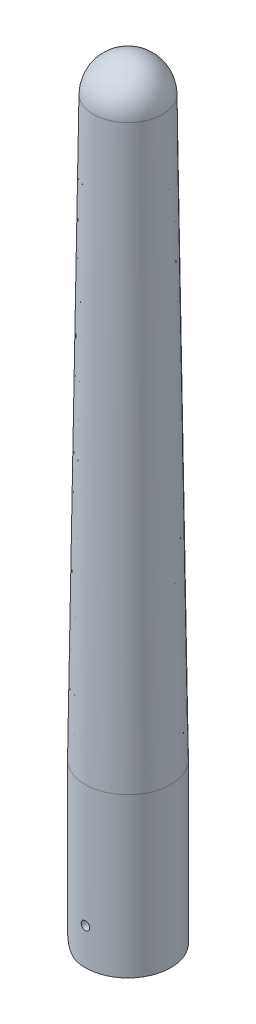
ISO-10303-21;
HEADER;
FILE_DESCRIPTION(('STEP AP214'),'2;1');
FILE_NAME('part.step','',(''),(''),'','','');
FILE_SCHEMA(('AUTOMOTIVE_DESIGN { 1 0 10303 214 1 1 1 1 }'));
ENDSEC;
DATA;
#1=APPLICATION_CONTEXT('core data for automotive mechanical design processes');
#2=APPLICATION_PROTOCOL_DEFINITION('international standard','automotive_design',2000,#1);
#3=PRODUCT_CONTEXT('',#1,'mechanical');
#4=PRODUCT('Part','Part','',(#3));
#5=PRODUCT_RELATED_PRODUCT_CATEGORY('part','',(#4));
#6=PRODUCT_DEFINITION_FORMATION('','',#4);
#7=PRODUCT_DEFINITION_CONTEXT('part definition',#1,'design');
#8=PRODUCT_DEFINITION('design','',#6,#7);
#9=PRODUCT_DEFINITION_SHAPE('','',#8);
#10=(LENGTH_UNIT() NAMED_UNIT(*) SI_UNIT(.MILLI.,.METRE.));
#11=(NAMED_UNIT(*) PLANE_ANGLE_UNIT() SI_UNIT($,.RADIAN.));
#12=(NAMED_UNIT(*) SI_UNIT($,.STERADIAN.) SOLID_ANGLE_UNIT());
#13=UNCERTAINTY_MEASURE_WITH_UNIT(LENGTH_MEASURE(1.E-05),#10,'distance_accuracy_value','');
#14=(GEOMETRIC_REPRESENTATION_CONTEXT(3) GLOBAL_UNCERTAINTY_ASSIGNED_CONTEXT((#13)) GLOBAL_UNIT_ASSIGNED_CONTEXT((#10,
#11,#12)) REPRESENTATION_CONTEXT('',''));
#15=CARTESIAN_POINT('',(0.,0.,0.));
#16=DIRECTION('',(0.,0.,1.));
#17=DIRECTION('',(1.,0.,0.));
#18=AXIS2_PLACEMENT_3D('',#15,#16,#17);
#19=CARTESIAN_POINT('',(-1.,3.5,-5.));
#20=DIRECTION('',(0.,0.,1.));
#21=DIRECTION('',(1.,0.,0.));
#22=AXIS2_PLACEMENT_3D('',#19,#20,#21);
#23=CYLINDRICAL_SURFACE('',#22,3.);
#24=DIRECTION('',(0.,0.,1.));
#25=VECTOR('',#24,1.);
#26=CARTESIAN_POINT('',(-1.,0.5,-5.));
#27=LINE('',#26,#25);
#28=CARTESIAN_POINT('',(-1.,0.5,-4.89897948556636));
#29=VERTEX_POINT('',#28);
#30=CARTESIAN_POINT('',(-1.,0.5,-3.));
#31=VERTEX_POINT('',#30);
#32=EDGE_CURVE('E148',#29,#31,#27,.T.);
#33=ORIENTED_EDGE('',*,*,#32,.T.);
#34=CARTESIAN_POINT('',(-1.,3.5,-3.));
#35=DIRECTION('',(0.,0.,-1.));
#36=DIRECTION('',(-1.,0.,0.));
#37=AXIS2_PLACEMENT_3D('',#34,#35,#36);
#38=CIRCLE('',#37,3.);
#39=CARTESIAN_POINT('',(-4.,3.5,-3.));
#40=VERTEX_POINT('',#39);
#41=EDGE_CURVE('E144',#31,#40,#38,.T.);
#42=ORIENTED_EDGE('',*,*,#41,.T.);
#43=CARTESIAN_POINT('',(-4.,3.5,-3.));
#44=CARTESIAN_POINT('',(-4.00001244204487,3.44398502961025,-2.99997000460442));
#45=CARTESIAN_POINT('',(-3.99843166086978,3.38798881357784,-3.00209095629103));
#46=CARTESIAN_POINT('',(-3.99218332919629,3.27655313093469,-3.01040203895422));
#47=CARTESIAN_POINT('',(-3.98752034536973,3.22111296364794,-3.01658614976712));
#48=CARTESIAN_POINT('',(-3.97528448696892,3.11183465613089,-3.0326897898657));
#49=CARTESIAN_POINT('',(-3.96774909464699,3.05798512684206,-3.04256117168853));
#50=CARTESIAN_POINT('',(-3.94992138177302,2.95147151927111,-3.0656705071164));
#51=CARTESIAN_POINT('',(-3.93962786416733,2.89880796649848,-3.07890992235472));
#52=CARTESIAN_POINT('',(-3.8973921371097,2.70949493381891,-3.13253561572151));
#53=CARTESIAN_POINT('',(-3.85766666829312,2.57700975431018,-3.1817867890066));
#54=CARTESIAN_POINT('',(-3.76281575029306,2.32294752534657,-3.29341572107848));
#55=CARTESIAN_POINT('',(-3.70759131741603,2.20144745358457,-3.35587719345375));
#56=CARTESIAN_POINT('',(-3.6008015299566,2.00171560896403,-3.46966247039576));
#57=CARTESIAN_POINT('',(-3.55241676573702,1.9207827573859,-3.5193163669213));
#58=CARTESIAN_POINT('',(-3.44896547463811,1.76467719994581,-3.62075693286085));
#59=CARTESIAN_POINT('',(-3.39389622830379,1.68950685887996,-3.67254446460588));
#60=CARTESIAN_POINT('',(-3.27733104616839,1.54490742978956,-3.77693381615053));
#61=CARTESIAN_POINT('',(-3.21583340729245,1.47547987197251,-3.82953584857559));
#62=CARTESIAN_POINT('',(-3.08657178818934,1.34249794552267,-3.93446368473418));
#63=CARTESIAN_POINT('',(-3.01880796290574,1.27894343174517,-3.98678949526404));
#64=CARTESIAN_POINT('',(-2.87589641380769,1.15692681649362,-4.09111014802944));
#65=CARTESIAN_POINT('',(-2.80064097491274,1.09857220388388,-4.14308349549148));
#66=CARTESIAN_POINT('',(-2.64389306071511,0.98867039552304,-4.24482739670546));
#67=CARTESIAN_POINT('',(-2.56240000879086,0.93712383032939,-4.29459774613355));
#68=CARTESIAN_POINT('',(-2.39371629381904,0.841633354519521,-4.39084474798937));
#69=CARTESIAN_POINT('',(-2.3065474130635,0.797662495452609,-4.43733271290357));
#70=CARTESIAN_POINT('',(-2.12667162452178,0.717864409452921,-4.52629205517278));
#71=CARTESIAN_POINT('',(-2.03396914878337,0.682030772788186,-4.56876657842812));
#72=CARTESIAN_POINT('',(-1.86562643412189,0.626565704791709,-4.63958414487302));
#73=CARTESIAN_POINT('',(-1.79100363230527,0.605103856305166,-4.66892248933568));
#74=CARTESIAN_POINT('',(-1.63920427713418,0.567846689857326,-4.72435562317077));
#75=CARTESIAN_POINT('',(-1.56202875641171,0.552049110464892,-4.75045170427522));
#76=CARTESIAN_POINT('',(-1.40494303198232,0.526383036102494,-4.79926444888295));
#77=CARTESIAN_POINT('',(-1.3250158631453,0.516563095829077,-4.82195233872827));
#78=CARTESIAN_POINT('',(-1.16354520558038,0.503360972757259,-4.86345234711309));
#79=CARTESIAN_POINT('',(-1.08199998593684,0.499986106567942,-4.88226003918559));
#80=CARTESIAN_POINT('',(-1.,0.5,-4.89897948556636));
#81=B_SPLINE_CURVE_WITH_KNOTS('',3,(#43,#44,#45,#46,#47,#48,#49,#50,#51,#52,#53,#54,#55,#56,#57,
#58,#59,#60,#61,#62,#63,#64,#65,#66,#67,#68,#69,#70,#71,#72,#73,#74,#75,#76,#77,#78,#79,#80),
.UNSPECIFIED.,.F.,.F.,(4,2,2,2,2,2,2,2,2,2,2,2,2,2,2,2,2,2,4),(0.,0.167952233380978,
0.335656180467112,0.501242774062107,0.666901350608378,1.10471949095996,1.54539998935887,
1.86472046160708,2.18417128151428,2.5037069491024,2.8232347176653,3.14830647568994,
3.47340832059258,3.79732869476218,4.12099302320663,4.36973894029999,4.61838543595607,
4.86902556705811,5.11995006235065),.UNSPECIFIED.);
#82=EDGE_CURVE('E163',#40,#29,#81,.T.);
#83=ORIENTED_EDGE('',*,*,#82,.T.);
#84=EDGE_LOOP('',(#33,#42,#83));
#85=FACE_BOUND('',#84,.T.);
#86=ADVANCED_FACE('F36',(#85),#23,.T.);
#87=CARTESIAN_POINT('',(0.,4.7625,-5.));
#88=DIRECTION('',(0.,0.,1.));
#89=DIRECTION('',(1.,0.,0.));
#90=AXIS2_PLACEMENT_3D('',#87,#88,#89);
#91=CYLINDRICAL_SURFACE('',#90,0.5);
#92=CARTESIAN_POINT('',(0.,4.7625,-3.));
#93=DIRECTION('',(0.,0.,-1.));
#94=DIRECTION('',(-1.,0.,0.));
#95=AXIS2_PLACEMENT_3D('',#92,#93,#94);
#96=CIRCLE('',#95,0.5);
#97=CARTESIAN_POINT('',(0.,5.2625,-3.));
#98=VERTEX_POINT('',#97);
#99=CARTESIAN_POINT('',(0.,4.2625,-3.));
#100=VERTEX_POINT('',#99);
#101=EDGE_CURVE('E51',#98,#100,#96,.F.);
#102=ORIENTED_EDGE('',*,*,#101,.T.);
#103=CARTESIAN_POINT('',(0.,4.2625,-3.));
#104=CARTESIAN_POINT('',(0.0279245639136445,4.26247519901758,-3.0000147639304));
#105=CARTESIAN_POINT('',(0.055837756491887,4.26483775850183,-2.99961054875443));
#106=CARTESIAN_POINT('',(0.110832206753166,4.2741494919612,-2.99807410355357));
#107=CARTESIAN_POINT('',(0.137914495790227,4.28109271741437,-2.9969428177627));
#108=CARTESIAN_POINT('',(0.190520410616297,4.29938067461085,-2.99406131473217));
#109=CARTESIAN_POINT('',(0.216043674938696,4.31072642264835,-2.99231095459141));
#110=CARTESIAN_POINT('',(0.26482528119673,4.33748110074219,-2.9883884234628));
#111=CARTESIAN_POINT('',(0.288083609782285,4.35289005474607,-2.98621624998891));
#112=CARTESIAN_POINT('',(0.331893550581974,4.38749005160079,-2.98166682330032));
#113=CARTESIAN_POINT('',(0.352420637095486,4.40671194518936,-2.97928799262738));
#114=CARTESIAN_POINT('',(0.389976046582247,4.4483274857591,-2.9746054532048));
#115=CARTESIAN_POINT('',(0.407003814285051,4.47072163516157,-2.97230175642609));
#116=CARTESIAN_POINT('',(0.437173866317821,4.51821486855929,-2.96801507546756));
#117=CARTESIAN_POINT('',(0.450291665381796,4.54332970856564,-2.96603414615731));
#118=CARTESIAN_POINT('',(0.472112172118847,4.59544346610524,-2.96263949656779));
#119=CARTESIAN_POINT('',(0.480815430627229,4.62244214809895,-2.96122570552704));
#120=CARTESIAN_POINT('',(0.493482800364944,4.67729572749661,-2.95914108655384));
#121=CARTESIAN_POINT('',(0.49748971053499,4.70514048162355,-2.95846355313407));
#122=CARTESIAN_POINT('',(0.500783361656072,4.76111538379644,-2.95790787498487));
#123=CARTESIAN_POINT('',(0.500070324317516,4.78924551837522,-2.95802969270745));
#124=CARTESIAN_POINT('',(0.493979010226865,4.84468566088102,-2.95905285943334));
#125=CARTESIAN_POINT('',(0.488648942843718,4.87200113598198,-2.95994615267881));
#126=CARTESIAN_POINT('',(0.473550565119978,4.92534442920873,-2.96239900004534));
#127=CARTESIAN_POINT('',(0.463782130822525,4.95137221134869,-2.96395857277451));
#128=CARTESIAN_POINT('',(0.440035229974665,5.00154623498664,-2.96757699355581));
#129=CARTESIAN_POINT('',(0.426036670162596,5.02568278834004,-2.96963821515902));
#130=CARTESIAN_POINT('',(0.394241728150704,5.07128167670101,-2.97402591987438));
#131=CARTESIAN_POINT('',(0.376445180776664,5.09274389533761,-2.97635241452118));
#132=CARTESIAN_POINT('',(0.337299196931074,5.13266247154126,-2.9810437450182));
#133=CARTESIAN_POINT('',(0.315908841019962,5.15107871053847,-2.98340870102549));
#134=CARTESIAN_POINT('',(0.270313606709418,5.18407142477227,-2.98788456267353));
#135=CARTESIAN_POINT('',(0.246107936431859,5.19864681589053,-2.98999539649458));
#136=CARTESIAN_POINT('',(0.195523810863718,5.2235495966137,-2.99372931333068));
#137=CARTESIAN_POINT('',(0.169142345470611,5.23387097856628,-2.99535170568755));
#138=CARTESIAN_POINT('',(0.115018377774362,5.24990568513903,-2.99791557548819));
#139=CARTESIAN_POINT('',(0.0872779685237822,5.25562587363564,-2.99885806696339));
#140=CARTESIAN_POINT('',(0.0395947870096444,5.26132709684266,-2.99980530629215));
#141=CARTESIAN_POINT('',(0.0197934446559688,5.26251086774561,-3.00000587638439));
#142=CARTESIAN_POINT('',(0.,5.2625,-3.));
#143=B_SPLINE_CURVE_WITH_KNOTS('',3,(#103,#104,#105,#106,#107,#108,#109,#110,#111,#112,#113,
#114,#115,#116,#117,#118,#119,#120,#121,#122,#123,#124,#125,#126,#127,#128,#129,#130,#131,#132,
#133,#134,#135,#136,#137,#138,#139,#140,#141,#142),.UNSPECIFIED.,.F.,.F.,(4,2,2,2,2,2,2,2,2,2,2,
2,2,2,2,2,2,2,2,4),(0.,0.0836539641001569,0.167199507173348,0.250764347685627,0.334329680719545,
0.41860095869616,0.502885598496281,0.587687467227778,0.672478751990037,0.756491152577013,
0.840499606871929,0.923641306490468,1.00678532827338,1.09033066685202,1.17387963955236,
1.25845388716987,1.34305198121945,1.42776914147558,1.51235968845851,1.57172612554727),.UNSPECIFIED.);
#144=EDGE_CURVE('E11',#100,#98,#143,.T.);
#145=ORIENTED_EDGE('',*,*,#144,.T.);
#146=EDGE_LOOP('',(#102,#145));
#147=FACE_BOUND('',#146,.T.);
#148=CARTESIAN_POINT('',(0.,5.2625,-5.));
#149=CARTESIAN_POINT('',(0.0280101768957787,5.26249878704981,-4.99999967760385));
#150=CARTESIAN_POINT('',(0.0560388725838866,5.26013836555178,-4.99976212798103));
#151=CARTESIAN_POINT('',(0.111319199248419,5.25075781485479,-4.99883733797369));
#152=CARTESIAN_POINT('',(0.138569939584414,5.24373255198771,-4.99814960217013));
#153=CARTESIAN_POINT('',(0.191485837726707,5.22522887970108,-4.99640207281535));
#154=CARTESIAN_POINT('',(0.217151942307455,5.21375315974076,-4.99534250400354));
#155=CARTESIAN_POINT('',(0.266188080480204,5.18667954603418,-4.99296978697153));
#156=CARTESIAN_POINT('',(0.289558569389539,5.17108247199993,-4.99165668919066));
#157=CARTESIAN_POINT('',(0.333429775337041,5.13614865116886,-4.98891872170662));
#158=CARTESIAN_POINT('',(0.353921072417447,5.11680010029898,-4.98749350786933));
#159=CARTESIAN_POINT('',(0.391371260715493,5.07493773286848,-4.98469478453131));
#160=CARTESIAN_POINT('',(0.408329988541327,5.05242376997881,-4.98332127742458));
#161=CARTESIAN_POINT('',(0.438266985221809,5.00481073415819,-4.98077795776392));
#162=CARTESIAN_POINT('',(0.45123673272744,4.97970627795257,-4.97960858355453));
#163=CARTESIAN_POINT('',(0.47277319237138,4.92766220704751,-4.97761018773262));
#164=CARTESIAN_POINT('',(0.481340013295646,4.90072263770803,-4.97678115771111));
#165=CARTESIAN_POINT('',(0.493799520800947,4.845869099567,-4.97556042036489));
#166=CARTESIAN_POINT('',(0.497707826501898,4.8179587115739,-4.97516725199048));
#167=CARTESIAN_POINT('',(0.50078764256768,4.76187556830211,-4.97485821530263));
#168=CARTESIAN_POINT('',(0.499959277435401,4.73370281993897,-4.97494233444373));
#169=CARTESIAN_POINT('',(0.493602140126339,4.67800234515334,-4.97557703449467));
#170=CARTESIAN_POINT('',(0.488090422062276,4.65047265033565,-4.97612592295326));
#171=CARTESIAN_POINT('',(0.472549572075293,4.59673101839945,-4.97762567143709));
#172=CARTESIAN_POINT('',(0.462520379127873,4.57051909908748,-4.97857653689246));
#173=CARTESIAN_POINT('',(0.438210446940754,4.52010320635056,-4.98077504726035));
#174=CARTESIAN_POINT('',(0.42392214135999,4.49590290525534,-4.98202321954079));
#175=CARTESIAN_POINT('',(0.391505013676614,4.45023739254406,-4.98467525866439));
#176=CARTESIAN_POINT('',(0.373376079168253,4.42877226100912,-4.98607913006392));
#177=CARTESIAN_POINT('',(0.333697056206035,4.38908730300549,-4.98889192656495));
#178=CARTESIAN_POINT('',(0.312132239425682,4.3708821990596,-4.99030084666499));
#179=CARTESIAN_POINT('',(0.266244740868556,4.33834818354481,-4.99295914539259));
#180=CARTESIAN_POINT('',(0.2419220559998,4.32401927632176,-4.99420852384128));
#181=CARTESIAN_POINT('',(0.191199052846182,4.29964498984487,-4.99640737833548));
#182=CARTESIAN_POINT('',(0.164798373194951,4.28960035759097,-4.99735680207385));
#183=CARTESIAN_POINT('',(0.110673608664966,4.27409054164412,-4.99884823720704));
#184=CARTESIAN_POINT('',(0.0829495633882998,4.26862522100469,-4.99939026078532));
#185=CARTESIAN_POINT('',(0.0270925495459517,4.26244784613262,-5.00000425834155));
#186=CARTESIAN_POINT('',(-0.00103815105274613,4.26171547587375,-5.00007824133868));
#187=CARTESIAN_POINT('',(-0.0570218966578501,4.26497143152438,-4.99975320878398));
#188=CARTESIAN_POINT('',(-0.0848749454102353,4.26895969365764,-4.99935419962234));
#189=CARTESIAN_POINT('',(-0.139454103417338,4.28152684771079,-4.99812930769597));
#190=CARTESIAN_POINT('',(-0.16618242448601,4.29009622723901,-4.9973043095902));
#191=CARTESIAN_POINT('',(-0.217822160691891,4.31157258701864,-4.99531999430305));
#192=CARTESIAN_POINT('',(-0.242733535078559,4.3244796645197,-4.99416066962627));
#193=CARTESIAN_POINT('',(-0.290124090086072,4.35431541933196,-4.99163237665211));
#194=CARTESIAN_POINT('',(-0.312594829874459,4.37125744446291,-4.99026271801721));
#195=CARTESIAN_POINT('',(-0.35438081165594,4.40866303387046,-4.9874696643476));
#196=CARTESIAN_POINT('',(-0.373695974424589,4.42912668653516,-4.98604626796486));
#197=CARTESIAN_POINT('',(-0.408693054943573,4.4730832873295,-4.98330012070377));
#198=CARTESIAN_POINT('',(-0.424361639339772,4.49658687827131,-4.98197775069488));
#199=CARTESIAN_POINT('',(-0.451529129371914,4.54590368007334,-4.97958916230445));
#200=CARTESIAN_POINT('',(-0.463028092026941,4.5717168593442,-4.97852294042019));
#201=CARTESIAN_POINT('',(-0.481507604342238,4.6248743697329,-4.97676973817025));
#202=CARTESIAN_POINT('',(-0.488496087405931,4.65221592004556,-4.97608209224894));
#203=CARTESIAN_POINT('',(-0.497782003564732,4.70769159898039,-4.97516182641438));
#204=CARTESIAN_POINT('',(-0.500079571199759,4.73582570484784,-4.97492919345093));
#205=CARTESIAN_POINT('',(-0.499916569235628,4.79195534417835,-4.97494556553781));
#206=CARTESIAN_POINT('',(-0.497476944796556,4.81995094144141,-4.97519245043504));
#207=CARTESIAN_POINT('',(-0.487952726481827,4.87513245858414,-4.97613551944773));
#208=CARTESIAN_POINT('',(-0.48086812738108,4.90231837755299,-4.97683170406859));
#209=CARTESIAN_POINT('',(-0.462260843148752,4.95510867452393,-4.97859434131593));
#210=CARTESIAN_POINT('',(-0.450738772170458,4.98071327081486,-4.9796607427018));
#211=CARTESIAN_POINT('',(-0.423585777455522,5.02962844583552,-4.98204375919679));
#212=CARTESIAN_POINT('',(-0.407954876727707,5.05293903741032,-4.98336037290475));
#213=CARTESIAN_POINT('',(-0.372949278142666,5.09671183723597,-4.98610243604849));
#214=CARTESIAN_POINT('',(-0.353558974445134,5.11716153818354,-4.98752832363375));
#215=CARTESIAN_POINT('',(-0.311615849612554,5.15452611634983,-4.99032427364392));
#216=CARTESIAN_POINT('',(-0.289062272054128,5.17144014567859,-4.99169432261488));
#217=CARTESIAN_POINT('',(-0.241370717080644,5.20128672692731,-4.99422781034581));
#218=CARTESIAN_POINT('',(-0.216226374673381,5.21420914547259,-4.99539072013406));
#219=CARTESIAN_POINT('',(-0.164129139550275,5.23563121141193,-4.99737314624948));
#220=CARTESIAN_POINT('',(-0.137178324912804,5.24413584547677,-4.99819304954827));
#221=CARTESIAN_POINT('',(-0.091729130702852,5.2543603085424,-4.99919106886867));
#222=CARTESIAN_POINT('',(-0.0735212764222543,5.25740852214968,-4.99949300345916));
#223=CARTESIAN_POINT('',(-0.0368782904086565,5.26147876303088,-4.99989757475393));
#224=CARTESIAN_POINT('',(-0.0184431596132789,5.26250079866093,-5.00000021228012));
#225=CARTESIAN_POINT('',(0.,5.2625,-5.));
#226=B_SPLINE_CURVE_WITH_KNOTS('',3,(#148,#149,#150,#151,#152,#153,#154,#155,#156,#157,#158,
#159,#160,#161,#162,#163,#164,#165,#166,#167,#168,#169,#170,#171,#172,#173,#174,#175,#176,#177,
#178,#179,#180,#181,#182,#183,#184,#185,#186,#187,#188,#189,#190,#191,#192,#193,#194,#195,#196,
#197,#198,#199,#200,#201,#202,#203,#204,#205,#206,#207,#208,#209,#210,#211,#212,#213,#214,#215,
#216,#217,#218,#219,#220,#221,#222,#223,#224,#225),.UNSPECIFIED.,.T.,.F.,(4,2,2,2,2,2,2,2,2,2,2,
2,2,2,2,2,2,2,2,2,2,2,2,2,2,2,2,2,2,2,2,2,2,2,2,2,2,2,4),(0.,0.083963183134237,
0.168018921417743,0.252023942866102,0.336012268791392,0.420269284311473,0.50453019610353,
0.588969877361109,0.67340747221252,0.757561160225982,0.841712636278883,0.925558987205553,
1.00940647080817,1.09340380686447,1.17740360165563,1.26177367098103,1.34614383489886,
1.43052870346791,1.5149110483772,1.59893094303879,1.68294970259572,1.76679467647153,
1.85064153024734,1.93476970374349,2.01889998905115,2.10333321804299,2.18776529237687,
2.27204845296502,2.35632919619793,2.44023814646978,2.5241471911302,2.608044626814,
2.6919415926948,2.77619458713827,2.86046776318479,2.94495315513121,3.02934297397648,
3.08462833616174,3.13991347034514),.UNSPECIFIED.);
#227=CARTESIAN_POINT('',(0.,5.2625,-5.));
#228=VERTEX_POINT('',#227);
#229=EDGE_CURVE('E199',#228,#228,#226,.T.);
#230=ORIENTED_EDGE('',*,*,#229,.T.);
#231=EDGE_LOOP('',(#230));
#232=FACE_BOUND('',#231,.T.);
#233=ADVANCED_FACE('F208',(#147,#232),#91,.F.);
#234=CARTESIAN_POINT('',(0.,0.,0.));
#235=DIRECTION('',(0.,-1.,0.));
#236=DIRECTION('',(0.,0.,-1.));
#237=AXIS2_PLACEMENT_3D('',#234,#235,#236);
#238=CYLINDRICAL_SURFACE('',#237,5.);
#239=ORIENTED_EDGE('',*,*,#229,.F.);
#240=EDGE_LOOP('',(#239));
#241=FACE_BOUND('',#240,.T.);
#242=CARTESIAN_POINT('',(0.5,4.7625,4.9749371855331));
#243=CARTESIAN_POINT('',(0.499998786696756,4.7905097820868,4.97493751398451));
#244=CARTESIAN_POINT('',(0.497638429491238,4.81853808420592,4.97517628497109));
#245=CARTESIAN_POINT('',(0.488258157381781,4.87381759314677,4.97610543779059));
#246=CARTESIAN_POINT('',(0.481233107443218,4.90106790901875,4.9767963173061));
#247=CARTESIAN_POINT('',(0.462730058034463,4.95398290960895,4.97855066523694));
#248=CARTESIAN_POINT('',(0.45125475814695,4.97964854469572,4.97961390773395));
#249=CARTESIAN_POINT('',(0.424182133695551,5.02868389614587,4.9819929028591));
#250=CARTESIAN_POINT('',(0.408585627812963,5.05205406724186,4.98330860532165));
#251=CARTESIAN_POINT('',(0.373652380999353,5.09592563182875,4.98604963354949));
#252=CARTESIAN_POINT('',(0.35430370905413,5.11641750475189,4.98747530002633));
#253=CARTESIAN_POINT('',(0.312440857659783,5.15386880450178,4.99027252617859));
#254=CARTESIAN_POINT('',(0.289926533453285,5.17082806970316,4.99164408337606));
#255=CARTESIAN_POINT('',(0.242313180825494,5.20076562850358,4.99418191577802));
#256=CARTESIAN_POINT('',(0.217208831264785,5.21373549939683,4.99534775447323));
#257=CARTESIAN_POINT('',(0.165164992143756,5.23527221657434,4.99733908437885));
#258=CARTESIAN_POINT('',(0.13822554733411,5.24383917018473,4.99816458388532));
#259=CARTESIAN_POINT('',(0.0833723913714752,5.25629895467663,4.99937983285513));
#260=CARTESIAN_POINT('',(0.0554622635157911,5.26020741637497,4.99977103921408));
#261=CARTESIAN_POINT('',(-0.00062037034447125,5.26328763456686,5.00007857799346));
#262=CARTESIAN_POINT('',(-0.0287928695272304,5.26245951387314,4.99999492272636));
#263=CARTESIAN_POINT('',(-0.0844944220322799,5.25610276367492,4.99936335655593));
#264=CARTESIAN_POINT('',(-0.112025414967489,5.25059094221805,4.99881710575856));
#265=CARTESIAN_POINT('',(-0.165769589752266,5.23504943552669,4.99732364632465));
#266=CARTESIAN_POINT('',(-0.191982754478864,5.22501969160621,4.99637643247977));
#267=CARTESIAN_POINT('',(-0.242400157339793,5.20070861837278,4.99418468741958));
#268=CARTESIAN_POINT('',(-0.266600785490825,5.18641985123492,4.99293963682879));
#269=CARTESIAN_POINT('',(-0.312266756587097,5.15400173833182,4.99029192259704));
#270=CARTESIAN_POINT('',(-0.333732019280413,5.13587227992741,4.98888925433406));
#271=CARTESIAN_POINT('',(-0.373416385911344,5.09619288524318,4.98607646733926));
#272=CARTESIAN_POINT('',(-0.391620873095172,5.07462832762921,4.98466634286514));
#273=CARTESIAN_POINT('',(-0.424153767678959,5.02874156739461,4.98200369964111));
#274=CARTESIAN_POINT('',(-0.438482169456445,5.00441936077393,4.98075118111982));
#275=CARTESIAN_POINT('',(-0.462856092286615,4.95369648740011,4.97854544757075));
#276=CARTESIAN_POINT('',(-0.47290071028648,4.92729538378856,4.97759229566277));
#277=CARTESIAN_POINT('',(-0.488410367818794,4.87316969769266,4.97609450935469));
#278=CARTESIAN_POINT('',(-0.493875546871517,4.84544515555628,4.97554986250884));
#279=CARTESIAN_POINT('',(-0.50005238769598,4.78958791023525,4.97493290263708));
#280=CARTESIAN_POINT('',(-0.500784498323606,4.76145748986758,4.97485855773802));
#281=CARTESIAN_POINT('',(-0.497528123435681,4.70547436708857,4.97518525677386));
#282=CARTESIAN_POINT('',(-0.493539701704877,4.67762166092982,4.97558629428531));
#283=CARTESIAN_POINT('',(-0.48097258725376,4.62304420886083,4.97681672211201));
#284=CARTESIAN_POINT('',(-0.472403563594454,4.59631721445267,4.97764521000673));
#285=CARTESIAN_POINT('',(-0.45092835983797,4.54467997413485,4.97963645519397));
#286=CARTESIAN_POINT('',(-0.438022080391794,4.51976976985641,4.98079922014335));
#287=CARTESIAN_POINT('',(-0.408187500711609,4.47238001298561,4.98333292177857));
#288=CARTESIAN_POINT('',(-0.391245649920346,4.44990902901687,4.98470455407336));
#289=CARTESIAN_POINT('',(-0.353840266725587,4.40812247336297,4.98749916312593));
#290=CARTESIAN_POINT('',(-0.333376647124067,4.38880697982996,4.98892214115433));
#291=CARTESIAN_POINT('',(-0.289419902113237,4.35380918330095,4.99166523924651));
#292=CARTESIAN_POINT('',(-0.265916127984727,4.33814022020689,4.99298497027737));
#293=CARTESIAN_POINT('',(-0.216598858708566,4.31097206574679,4.99536721053315));
#294=CARTESIAN_POINT('',(-0.190785395214813,4.29947281724645,4.99642972328246));
#295=CARTESIAN_POINT('',(-0.137628063216408,4.28099311617233,4.99817605207003));
#296=CARTESIAN_POINT('',(-0.11028701882498,4.27400460633739,4.99886054302824));
#297=CARTESIAN_POINT('',(-0.0548124069918398,4.26471846521008,4.99977647306824));
#298=CARTESIAN_POINT('',(-0.0266788618461089,4.26242070208298,5.00000792488281));
#299=CARTESIAN_POINT('',(0.0294511120378732,4.26258313321997,4.99999169156635));
#300=CARTESIAN_POINT('',(0.0574476036122639,4.26502261841833,4.99974609188335));
#301=CARTESIAN_POINT('',(0.112630944178181,4.27454687282849,4.99880746788795));
#302=CARTESIAN_POINT('',(0.139817792534183,4.28163164568648,4.99811444322437));
#303=CARTESIAN_POINT('',(0.192609954383872,4.30023962869647,4.99635861906981));
#304=CARTESIAN_POINT('',(0.218215483038764,4.31176223346708,4.99529587001624));
#305=CARTESIAN_POINT('',(0.267132300077398,4.33891658445849,4.99291906208148));
#306=CARTESIAN_POINT('',(0.290443601884279,4.35454830663556,4.99160500467077));
#307=CARTESIAN_POINT('',(0.334216362213469,4.38955480951188,4.98886592334527));
#308=CARTESIAN_POINT('',(0.35466546310967,4.4089450081224,4.9874404573035));
#309=CARTESIAN_POINT('',(0.392028879696571,4.45088767577272,4.98464295384829));
#310=CARTESIAN_POINT('',(0.408942345923924,4.47344090258454,4.98327092933888));
#311=CARTESIAN_POINT('',(0.438788320212027,4.52113217095996,4.980731917053));
#312=CARTESIAN_POINT('',(0.451710593997418,4.54627664066203,4.97956545962653));
#313=CARTESIAN_POINT('',(0.473132354049385,4.59837414562312,4.97757597381231));
#314=CARTESIAN_POINT('',(0.481636828944929,4.62532510196286,4.9767525582668));
#315=CARTESIAN_POINT('',(0.491860844166765,4.67077387044956,4.97575003769072));
#316=CARTESIAN_POINT('',(0.494908856199113,4.68898112565322,4.97544665967847));
#317=CARTESIAN_POINT('',(0.498978829302557,4.72562291152128,4.97504012588832));
#318=CARTESIAN_POINT('',(0.500000798878632,4.7440574412313,4.97493696926992));
#319=CARTESIAN_POINT('',(0.5,4.7625,4.9749371855331));
#320=B_SPLINE_CURVE_WITH_KNOTS('',3,(#242,#243,#244,#245,#246,#247,#248,#249,#250,#251,#252,
#253,#254,#255,#256,#257,#258,#259,#260,#261,#262,#263,#264,#265,#266,#267,#268,#269,#270,#271,
#272,#273,#274,#275,#276,#277,#278,#279,#280,#281,#282,#283,#284,#285,#286,#287,#288,#289,#290,
#291,#292,#293,#294,#295,#296,#297,#298,#299,#300,#301,#302,#303,#304,#305,#306,#307,#308,#309,
#310,#311,#312,#313,#314,#315,#316,#317,#318,#319),.UNSPECIFIED.,.T.,.F.,(4,2,2,2,2,2,2,2,2,2,2,
2,2,2,2,2,2,2,2,2,2,2,2,2,2,2,2,2,2,2,2,2,2,2,2,2,2,2,4),(0.,0.0839619972182308,
0.168016575910885,0.252020245498737,0.336007240210657,0.420265807649625,0.504528229276264,
0.588967349856458,0.673404412038973,0.757557354492248,0.841708114991162,0.925558159093308,
1.00940929240487,1.09340772733207,1.17740862609264,1.26177712542501,1.34614574713781,
1.43053214558967,1.51491597297516,1.59893498153883,1.68295285483435,1.76679407352264,
1.85063721280524,1.93476594905859,2.01889676861601,2.10333068409059,2.18776344259002,
2.27204496347181,2.35632411556575,2.44023566734241,2.52414728498329,2.60804745997623,
2.69194714405399,2.77619857518994,2.86047022517262,2.94495620535238,3.02934657447001,
3.08463013803023,3.13991346951908),.UNSPECIFIED.);
#321=CARTESIAN_POINT('',(0.5,4.7625,4.9749371855331));
#322=VERTEX_POINT('',#321);
#323=EDGE_CURVE('E193',#322,#322,#320,.T.);
#324=ORIENTED_EDGE('',*,*,#323,.F.);
#325=EDGE_LOOP('',(#324));
#326=FACE_BOUND('',#325,.T.);
#327=CARTESIAN_POINT('',(-1.,0.5,4.89897948556636));
#328=CARTESIAN_POINT('',(-1.08234962306499,0.499986264817573,4.88218859818453));
#329=CARTESIAN_POINT('',(-1.16423920706714,0.503389811860819,4.86329222431812));
#330=CARTESIAN_POINT('',(-1.32639580964566,0.516704057342398,4.82157934502137));
#331=CARTESIAN_POINT('',(-1.40666432342228,0.526608447931834,4.79876665546974));
#332=CARTESIAN_POINT('',(-1.56445735384612,0.552502856712107,4.74965919245298));
#333=CARTESIAN_POINT('',(-1.64199768099718,0.5684476963502,4.72339119209978));
#334=CARTESIAN_POINT('',(-1.7944724214973,0.606043429097126,4.66759774616889));
#335=CARTESIAN_POINT('',(-1.86940626492176,0.627695561374434,4.638071593991));
#336=CARTESIAN_POINT('',(-2.08911654476719,0.700440223503693,4.54540680144));
#337=CARTESIAN_POINT('',(-2.22953837921688,0.759447890943269,4.47794813791139));
#338=CARTESIAN_POINT('',(-2.49674966144726,0.895708440232785,4.33466791879024));
#339=CARTESIAN_POINT('',(-2.62351028590355,0.972998840115289,4.25882933959151));
#340=CARTESIAN_POINT('',(-2.87947158436822,1.15570129206003,4.09087727925126));
#341=CARTESIAN_POINT('',(-3.00641785794272,1.26355621085363,3.99798910981836));
#342=CARTESIAN_POINT('',(-3.24046585679878,1.49805037146107,3.81075239171346));
#343=CARTESIAN_POINT('',(-3.34755504339516,1.62470139175858,3.71640296079428));
#344=CARTESIAN_POINT('',(-3.52962460970653,1.88051843725028,3.54339317808233));
#345=CARTESIAN_POINT('',(-3.60688915783605,2.00768613599886,3.46418292004352));
#346=CARTESIAN_POINT('',(-3.74348939718221,2.27690421521044,3.3160777901339));
#347=CARTESIAN_POINT('',(-3.80285759734266,2.41892697112182,3.24716433030008));
#348=CARTESIAN_POINT('',(-3.88525915904755,2.67116622135991,3.14763003936433));
#349=CARTESIAN_POINT('',(-3.91384970526196,2.77746965591426,3.11177117966934));
#350=CARTESIAN_POINT('',(-3.95943785178449,2.99595219490619,3.05356277955589));
#351=CARTESIAN_POINT('',(-3.97647707300007,3.10810861938826,3.03116477144108));
#352=CARTESIAN_POINT('',(-3.99135779043266,3.26777549032209,3.01149544061086));
#353=CARTESIAN_POINT('',(-3.99458907019243,3.31400912356982,3.00720397642665));
#354=CARTESIAN_POINT('',(-3.99891271293557,3.40682000345541,3.00145055094132));
#355=CARTESIAN_POINT('',(-4.00000188306987,3.45339765930835,2.99999281339309));
#356=CARTESIAN_POINT('',(-4.,3.5,3.));
#357=B_SPLINE_CURVE_WITH_KNOTS('',3,(#327,#328,#329,#330,#331,#332,#333,#334,#335,#336,#337,
#338,#339,#340,#341,#342,#343,#344,#345,#346,#347,#348,#349,#350,#351,#352,#353,#354,#355,#356),
.UNSPECIFIED.,.F.,.F.,(4,2,2,2,2,2,2,2,2,2,2,2,2,2,4),(0.,0.251990676148488,0.503737203375385,
0.75363686292484,1.00359082549306,1.50117768777981,1.99979464555732,2.56987877280039,
3.14032166076337,3.64455080724534,4.14785841774119,4.4940317872084,4.83895112416978,
4.97846822477555,5.11819312075111),.UNSPECIFIED.);
#358=CARTESIAN_POINT('',(-1.,0.5,4.89897948556636));
#359=VERTEX_POINT('',#358);
#360=CARTESIAN_POINT('',(-4.,3.5,3.));
#361=VERTEX_POINT('',#360);
#362=EDGE_CURVE('E185',#359,#361,#357,.T.);
#363=ORIENTED_EDGE('',*,*,#362,.F.);
#364=CARTESIAN_POINT('',(0.,0.5,0.));
#365=DIRECTION('',(0.,1.,0.));
#366=DIRECTION('',(0.,0.,1.));
#367=AXIS2_PLACEMENT_3D('',#364,#365,#366);
#368=CIRCLE('',#367,5.);
#369=EDGE_CURVE('E160',#29,#359,#368,.F.);
#370=ORIENTED_EDGE('',*,*,#369,.F.);
#371=ORIENTED_EDGE('',*,*,#82,.F.);
#372=DIRECTION('',(0.,-1.,0.));
#373=VECTOR('',#372,1.);
#374=CARTESIAN_POINT('',(-4.,0.,-3.));
#375=LINE('',#374,#373);
#376=CARTESIAN_POINT('',(-4.,7.,-3.));
#377=VERTEX_POINT('',#376);
#378=EDGE_CURVE('E171',#377,#40,#375,.T.);
#379=ORIENTED_EDGE('',*,*,#378,.F.);
#380=CARTESIAN_POINT('',(0.,3.00000000000002,0.));
#381=DIRECTION('',(0.707106781186546,0.707106781186549,0.));
#382=DIRECTION('',(0.707106781186549,-0.707106781186546,0.));
#383=AXIS2_PLACEMENT_3D('',#380,#381,#382);
#384=ELLIPSE('',#383,7.07106781186546,5.);
#385=CARTESIAN_POINT('',(-4.,7.,3.));
#386=VERTEX_POINT('',#385);
#387=EDGE_CURVE('E235',#386,#377,#384,.F.);
#388=ORIENTED_EDGE('',*,*,#387,.F.);
#389=DIRECTION('',(0.,-1.,0.));
#390=VECTOR('',#389,1.);
#391=CARTESIAN_POINT('',(-4.,0.,3.));
#392=LINE('',#391,#390);
#393=EDGE_CURVE('E121',#361,#386,#392,.F.);
#394=ORIENTED_EDGE('',*,*,#393,.F.);
#395=EDGE_LOOP('',(#363,#370,#371,#379,#388,#394));
#396=FACE_BOUND('',#395,.T.);
#397=CARTESIAN_POINT('',(0.,19.05,0.));
#398=DIRECTION('',(0.,-1.,0.));
#399=DIRECTION('',(0.,0.,-1.));
#400=AXIS2_PLACEMENT_3D('',#397,#398,#399);
#401=CIRCLE('',#400,5.);
#402=CARTESIAN_POINT('',(0.,19.05,-5.));
#403=VERTEX_POINT('',#402);
#404=EDGE_CURVE('E157',#403,#403,#401,.T.);
#405=ORIENTED_EDGE('',*,*,#404,.T.);
#406=EDGE_LOOP('',(#405));
#407=FACE_BOUND('',#406,.T.);
#408=ADVANCED_FACE('F38',(#241,#326,#396,#407),#238,.T.);
#409=CARTESIAN_POINT('',(0.,19.05,0.));
#410=DIRECTION('',(0.,-1.,0.));
#411=DIRECTION('',(0.,0.,-1.));
#412=AXIS2_PLACEMENT_3D('',#409,#410,#411);
#413=CONICAL_SURFACE('',#412,5.,0.0140042925842664);
#414=CARTESIAN_POINT('',(0.,86.424,0.));
#415=DIRECTION('',(0.,-1.,0.));
#416=DIRECTION('',(0.,0.,-1.));
#417=AXIS2_PLACEMENT_3D('',#414,#415,#416);
#418=CIRCLE('',#417,4.05641310513419);
#419=CARTESIAN_POINT('',(0.,86.424,-4.05641310513419));
#420=VERTEX_POINT('',#419);
#421=EDGE_CURVE('E151',#420,#420,#418,.T.);
#422=ORIENTED_EDGE('',*,*,#421,.T.);
#423=EDGE_LOOP('',(#422));
#424=FACE_BOUND('',#423,.T.);
#425=ORIENTED_EDGE('',*,*,#404,.F.);
#426=EDGE_LOOP('',(#425));
#427=FACE_BOUND('',#426,.T.);
#428=ADVANCED_FACE('F246',(#424,#427),#413,.T.);
#429=CARTESIAN_POINT('',(0.,86.367189090062,0.));
#430=DIRECTION('',(0.,-1.,0.));
#431=DIRECTION('',(1.,0.,0.));
#432=AXIS2_PLACEMENT_3D('',#429,#430,#431);
#433=SPHERICAL_SURFACE('',#432,4.05681090993805);
#434=ORIENTED_EDGE('',*,*,#421,.F.);
#435=EDGE_LOOP('',(#434));
#436=FACE_BOUND('',#435,.T.);
#437=ADVANCED_FACE('F179',(#436),#433,.T.);
#438=ORIENTED_EDGE('',*,*,#362,.T.);
#439=CARTESIAN_POINT('',(-1.,3.5,3.));
#440=DIRECTION('',(0.,0.,1.));
#441=DIRECTION('',(1.,0.,0.));
#442=AXIS2_PLACEMENT_3D('',#439,#440,#441);
#443=CIRCLE('',#442,3.);
#444=CARTESIAN_POINT('',(-1.,0.5,3.));
#445=VERTEX_POINT('',#444);
#446=EDGE_CURVE('E140',#361,#445,#443,.T.);
#447=ORIENTED_EDGE('',*,*,#446,.T.);
#448=EDGE_CURVE('E152',#445,#359,#27,.T.);
#449=ORIENTED_EDGE('',*,*,#448,.T.);
#450=EDGE_LOOP('',(#438,#447,#449));
#451=FACE_BOUND('',#450,.T.);
#452=ADVANCED_FACE('F173',(#451),#23,.T.);
#453=CARTESIAN_POINT('',(-1.,0.5,-5.));
#454=DIRECTION('',(0.,1.,0.));
#455=DIRECTION('',(0.,0.,1.));
#456=AXIS2_PLACEMENT_3D('',#453,#454,#455);
#457=PLANE('',#456);
#458=CARTESIAN_POINT('',(0.,0.5,0.));
#459=DIRECTION('',(0.,-1.,0.));
#460=DIRECTION('',(0.,0.,-1.));
#461=AXIS2_PLACEMENT_3D('',#458,#459,#460);
#462=CIRCLE('',#461,3.);
#463=CARTESIAN_POINT('',(0.,0.5,-3.));
#464=VERTEX_POINT('',#463);
#465=CARTESIAN_POINT('',(0.,0.5,3.));
#466=VERTEX_POINT('',#465);
#467=EDGE_CURVE('E135',#464,#466,#462,.T.);
#468=ORIENTED_EDGE('',*,*,#467,.F.);
#469=DIRECTION('',(1.,0.,0.));
#470=VECTOR('',#469,1.);
#471=CARTESIAN_POINT('',(-5.,0.5,-3.));
#472=LINE('',#471,#470);
#473=EDGE_CURVE('E129',#31,#464,#472,.T.);
#474=ORIENTED_EDGE('',*,*,#473,.F.);
#475=ORIENTED_EDGE('',*,*,#32,.F.);
#476=ORIENTED_EDGE('',*,*,#369,.T.);
#477=ORIENTED_EDGE('',*,*,#448,.F.);
#478=DIRECTION('',(-1.,0.,0.));
#479=VECTOR('',#478,1.);
#480=CARTESIAN_POINT('',(0.,0.5,3.));
#481=LINE('',#480,#479);
#482=EDGE_CURVE('E131',#466,#445,#481,.T.);
#483=ORIENTED_EDGE('',*,*,#482,.F.);
#484=EDGE_LOOP('',(#468,#474,#475,#476,#477,#483));
#485=FACE_BOUND('',#484,.T.);
#486=ADVANCED_FACE('F178',(#485),#457,.F.);
#487=CARTESIAN_POINT('',(-4.,7.,-5.));
#488=DIRECTION('',(0.707106781186546,0.707106781186549,0.));
#489=DIRECTION('',(-0.707106781186549,0.707106781186546,0.));
#490=AXIS2_PLACEMENT_3D('',#487,#488,#489);
#491=PLANE('',#490);
#492=DIRECTION('',(0.,0.,1.));
#493=VECTOR('',#492,1.);
#494=CARTESIAN_POINT('',(-4.,7.,-5.));
#495=LINE('',#494,#493);
#496=EDGE_CURVE('E147',#377,#386,#495,.T.);
#497=ORIENTED_EDGE('',*,*,#496,.T.);
#498=ORIENTED_EDGE('',*,*,#387,.T.);
#499=EDGE_LOOP('',(#497,#498));
#500=FACE_BOUND('',#499,.T.);
#501=ADVANCED_FACE('F181',(#500),#491,.F.);
#502=CARTESIAN_POINT('',(0.,4.7625,3.));
#503=DIRECTION('',(0.,0.,1.));
#504=DIRECTION('',(1.,0.,0.));
#505=AXIS2_PLACEMENT_3D('',#502,#503,#504);
#506=CIRCLE('',#505,0.5);
#507=CARTESIAN_POINT('',(0.,4.2625,3.));
#508=VERTEX_POINT('',#507);
#509=CARTESIAN_POINT('',(0.,5.2625,3.));
#510=VERTEX_POINT('',#509);
#511=EDGE_CURVE('E219',#508,#510,#506,.F.);
#512=ORIENTED_EDGE('',*,*,#511,.T.);
#513=CARTESIAN_POINT('',(0.,5.2625,3.));
#514=CARTESIAN_POINT('',(0.0279245639136445,5.26252480098242,3.0000147639304));
#515=CARTESIAN_POINT('',(0.0558377564918871,5.26016224149817,2.99961054875443));
#516=CARTESIAN_POINT('',(0.110832206753167,5.2508505080388,2.99807410355357));
#517=CARTESIAN_POINT('',(0.137914495790228,5.24390728258563,2.9969428177627));
#518=CARTESIAN_POINT('',(0.190520410616297,5.22561932538915,2.99406131473217));
#519=CARTESIAN_POINT('',(0.216043674938696,5.21427357735165,2.99231095459141));
#520=CARTESIAN_POINT('',(0.264825281196731,5.18751889925781,2.9883884234628));
#521=CARTESIAN_POINT('',(0.288083609782285,5.17210994525393,2.98621624998891));
#522=CARTESIAN_POINT('',(0.331893550581973,5.13750994839921,2.98166682330032));
#523=CARTESIAN_POINT('',(0.352420637095486,5.11828805481064,2.97928799262738));
#524=CARTESIAN_POINT('',(0.389976046582247,5.0766725142409,2.9746054532048));
#525=CARTESIAN_POINT('',(0.407003814285051,5.05427836483843,2.97230175642609));
#526=CARTESIAN_POINT('',(0.437173866317821,5.00678513144071,2.96801507546756));
#527=CARTESIAN_POINT('',(0.450291665381796,4.98167029143436,2.96603414615731));
#528=CARTESIAN_POINT('',(0.472112172118847,4.92955653389476,2.96263949656779));
#529=CARTESIAN_POINT('',(0.480815430627229,4.90255785190105,2.96122570552704));
#530=CARTESIAN_POINT('',(0.493482800364944,4.84770427250339,2.95914108655384));
#531=CARTESIAN_POINT('',(0.49748971053499,4.81985951837645,2.95846355313407));
#532=CARTESIAN_POINT('',(0.500783361656072,4.76388461620356,2.95790787498487));
#533=CARTESIAN_POINT('',(0.500070324317516,4.73575448162478,2.95802969270745));
#534=CARTESIAN_POINT('',(0.493979010226865,4.68031433911898,2.95905285943334));
#535=CARTESIAN_POINT('',(0.488648942843718,4.65299886401802,2.95994615267881));
#536=CARTESIAN_POINT('',(0.473550565119978,4.59965557079127,2.96239900004534));
#537=CARTESIAN_POINT('',(0.463782130822525,4.57362778865131,2.96395857277451));
#538=CARTESIAN_POINT('',(0.440035229974665,4.52345376501336,2.96757699355581));
#539=CARTESIAN_POINT('',(0.426036670162596,4.49931721165996,2.96963821515902));
#540=CARTESIAN_POINT('',(0.394241728150704,4.45371832329899,2.97402591987438));
#541=CARTESIAN_POINT('',(0.376445180776664,4.43225610466239,2.97635241452118));
#542=CARTESIAN_POINT('',(0.337299196931074,4.39233752845874,2.9810437450182));
#543=CARTESIAN_POINT('',(0.315908841019962,4.37392128946153,2.98340870102549));
#544=CARTESIAN_POINT('',(0.270313606709418,4.34092857522773,2.98788456267353));
#545=CARTESIAN_POINT('',(0.246107936431859,4.32635318410947,2.98999539649458));
#546=CARTESIAN_POINT('',(0.195523810863718,4.3014504033863,2.99372931333068));
#547=CARTESIAN_POINT('',(0.169142345470611,4.29112902143372,2.99535170568755));
#548=CARTESIAN_POINT('',(0.115018377774362,4.27509431486097,2.99791557548819));
#549=CARTESIAN_POINT('',(0.087277968523782,4.26937412636436,2.99885806696339));
#550=CARTESIAN_POINT('',(0.0395947870096443,4.26367290315734,2.99980530629215));
#551=CARTESIAN_POINT('',(0.0197934446559688,4.26248913225439,3.00000587638439));
#552=CARTESIAN_POINT('',(0.,4.2625,3.));
#553=B_SPLINE_CURVE_WITH_KNOTS('',3,(#513,#514,#515,#516,#517,#518,#519,#520,#521,#522,#523,
#524,#525,#526,#527,#528,#529,#530,#531,#532,#533,#534,#535,#536,#537,#538,#539,#540,#541,#542,
#543,#544,#545,#546,#547,#548,#549,#550,#551,#552),.UNSPECIFIED.,.F.,.F.,(4,2,2,2,2,2,2,2,2,2,2,
2,2,2,2,2,2,2,2,4),(0.,0.0836539641001568,0.167199507173348,0.250764347685628,0.334329680719545,
0.418600958696158,0.502885598496281,0.587687467227778,0.672478751990038,0.756491152577013,
0.840499606871929,0.923641306490469,1.00678532827338,1.09033066685202,1.17387963955236,
1.25845388716987,1.34305198121945,1.42776914147558,1.51235968845851,1.57172612554727),.UNSPECIFIED.);
#554=EDGE_CURVE('E113',#510,#508,#553,.T.);
#555=ORIENTED_EDGE('',*,*,#554,.T.);
#556=EDGE_LOOP('',(#512,#555));
#557=FACE_BOUND('',#556,.T.);
#558=ORIENTED_EDGE('',*,*,#323,.T.);
#559=EDGE_LOOP('',(#558));
#560=FACE_BOUND('',#559,.T.);
#561=ADVANCED_FACE('F204',(#557,#560),#91,.F.);
#562=CARTESIAN_POINT('',(0.,7.,0.));
#563=DIRECTION('',(0.,-1.,0.));
#564=DIRECTION('',(0.,0.,-1.));
#565=AXIS2_PLACEMENT_3D('',#562,#563,#564);
#566=PLANE('',#565);
#567=ORIENTED_EDGE('',*,*,#496,.F.);
#568=DIRECTION('',(1.,0.,0.));
#569=VECTOR('',#568,1.);
#570=CARTESIAN_POINT('',(-5.,7.,-3.));
#571=LINE('',#570,#569);
#572=CARTESIAN_POINT('',(0.,7.,-3.));
#573=VERTEX_POINT('',#572);
#574=EDGE_CURVE('E124',#377,#573,#571,.T.);
#575=ORIENTED_EDGE('',*,*,#574,.T.);
#576=CARTESIAN_POINT('',(0.,7.,0.));
#577=DIRECTION('',(0.,-1.,0.));
#578=DIRECTION('',(0.,0.,-1.));
#579=AXIS2_PLACEMENT_3D('',#576,#577,#578);
#580=CIRCLE('',#579,3.);
#581=CARTESIAN_POINT('',(0.,7.,3.));
#582=VERTEX_POINT('',#581);
#583=EDGE_CURVE('E110',#573,#582,#580,.T.);
#584=ORIENTED_EDGE('',*,*,#583,.T.);
#585=DIRECTION('',(-1.,0.,0.));
#586=VECTOR('',#585,1.);
#587=CARTESIAN_POINT('',(0.,7.,3.));
#588=LINE('',#587,#586);
#589=EDGE_CURVE('E118',#582,#386,#588,.T.);
#590=ORIENTED_EDGE('',*,*,#589,.T.);
#591=EDGE_LOOP('',(#567,#575,#584,#590));
#592=FACE_BOUND('',#591,.T.);
#593=ADVANCED_FACE('F126',(#592),#566,.T.);
#594=CARTESIAN_POINT('',(0.,7.,0.));
#595=DIRECTION('',(0.,-1.,0.));
#596=DIRECTION('',(0.,0.,-1.));
#597=AXIS2_PLACEMENT_3D('',#594,#595,#596);
#598=CYLINDRICAL_SURFACE('',#597,3.);
#599=DIRECTION('',(0.,-1.,0.));
#600=VECTOR('',#599,1.);
#601=CARTESIAN_POINT('',(0.,7.,3.));
#602=LINE('',#601,#600);
#603=EDGE_CURVE('E66',#582,#510,#602,.T.);
#604=ORIENTED_EDGE('',*,*,#603,.F.);
#605=ORIENTED_EDGE('',*,*,#583,.F.);
#606=DIRECTION('',(0.,-1.,0.));
#607=VECTOR('',#606,1.);
#608=CARTESIAN_POINT('',(0.,7.,-3.));
#609=LINE('',#608,#607);
#610=EDGE_CURVE('E139',#573,#98,#609,.T.);
#611=ORIENTED_EDGE('',*,*,#610,.T.);
#612=ORIENTED_EDGE('',*,*,#144,.F.);
#613=EDGE_CURVE('E58',#100,#464,#609,.T.);
#614=ORIENTED_EDGE('',*,*,#613,.T.);
#615=ORIENTED_EDGE('',*,*,#467,.T.);
#616=EDGE_CURVE('E115',#508,#466,#602,.T.);
#617=ORIENTED_EDGE('',*,*,#616,.F.);
#618=ORIENTED_EDGE('',*,*,#554,.F.);
#619=EDGE_LOOP('',(#604,#605,#611,#612,#614,#615,#617,#618));
#620=FACE_BOUND('',#619,.T.);
#621=ADVANCED_FACE('F107',(#620),#598,.F.);
#622=CARTESIAN_POINT('',(-5.,7.,-3.));
#623=DIRECTION('',(0.,0.,-1.));
#624=DIRECTION('',(-1.,0.,0.));
#625=AXIS2_PLACEMENT_3D('',#622,#623,#624);
#626=PLANE('',#625);
#627=ORIENTED_EDGE('',*,*,#473,.T.);
#628=ORIENTED_EDGE('',*,*,#613,.F.);
#629=ORIENTED_EDGE('',*,*,#101,.F.);
#630=ORIENTED_EDGE('',*,*,#610,.F.);
#631=ORIENTED_EDGE('',*,*,#574,.F.);
#632=ORIENTED_EDGE('',*,*,#378,.T.);
#633=ORIENTED_EDGE('',*,*,#41,.F.);
#634=EDGE_LOOP('',(#627,#628,#629,#630,#631,#632,#633));
#635=FACE_BOUND('',#634,.T.);
#636=ADVANCED_FACE('F223',(#635),#626,.F.);
#637=CARTESIAN_POINT('',(0.,7.,3.));
#638=DIRECTION('',(0.,0.,1.));
#639=DIRECTION('',(1.,0.,0.));
#640=AXIS2_PLACEMENT_3D('',#637,#638,#639);
#641=PLANE('',#640);
#642=ORIENTED_EDGE('',*,*,#393,.T.);
#643=ORIENTED_EDGE('',*,*,#589,.F.);
#644=ORIENTED_EDGE('',*,*,#603,.T.);
#645=ORIENTED_EDGE('',*,*,#511,.F.);
#646=ORIENTED_EDGE('',*,*,#616,.T.);
#647=ORIENTED_EDGE('',*,*,#482,.T.);
#648=ORIENTED_EDGE('',*,*,#446,.F.);
#649=EDGE_LOOP('',(#642,#643,#644,#645,#646,#647,#648));
#650=FACE_BOUND('',#649,.T.);
#651=ADVANCED_FACE('F119',(#650),#641,.F.);
#652=CLOSED_SHELL('',(#86,#233,#408,#428,#437,#452,#486,#501,#561,#593,#621,#636,#651));
#653=MANIFOLD_SOLID_BREP('B2',#652);
#654=ADVANCED_BREP_SHAPE_REPRESENTATION('',(#18,#653),#14);
#655=SHAPE_DEFINITION_REPRESENTATION(#9,#654);
ENDSEC;
END-ISO-10303-21;
